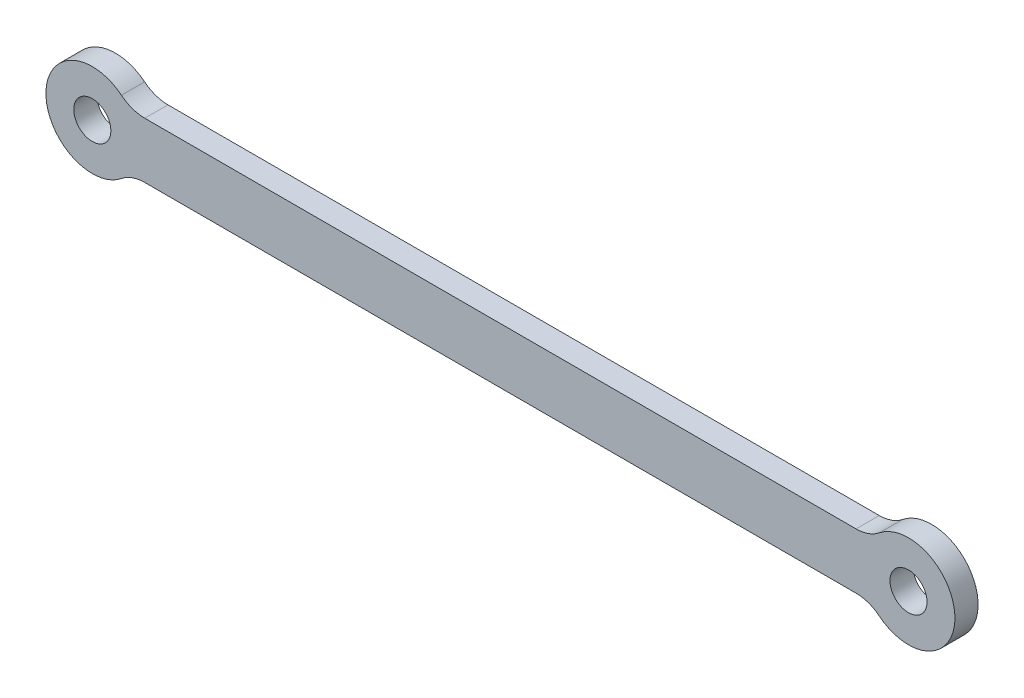
ISO-10303-21;
HEADER;
FILE_DESCRIPTION(('STEP AP214'),'2;1');
FILE_NAME('part.step','',(''),(''),'','','');
FILE_SCHEMA(('AUTOMOTIVE_DESIGN { 1 0 10303 214 1 1 1 1 }'));
ENDSEC;
DATA;
#1=APPLICATION_CONTEXT('core data for automotive mechanical design processes');
#2=APPLICATION_PROTOCOL_DEFINITION('international standard','automotive_design',2000,#1);
#3=PRODUCT_CONTEXT('',#1,'mechanical');
#4=PRODUCT('Part','Part','',(#3));
#5=PRODUCT_RELATED_PRODUCT_CATEGORY('part','',(#4));
#6=PRODUCT_DEFINITION_FORMATION('','',#4);
#7=PRODUCT_DEFINITION_CONTEXT('part definition',#1,'design');
#8=PRODUCT_DEFINITION('design','',#6,#7);
#9=PRODUCT_DEFINITION_SHAPE('','',#8);
#10=(LENGTH_UNIT() NAMED_UNIT(*) SI_UNIT(.MILLI.,.METRE.));
#11=(NAMED_UNIT(*) PLANE_ANGLE_UNIT() SI_UNIT($,.RADIAN.));
#12=(NAMED_UNIT(*) SI_UNIT($,.STERADIAN.) SOLID_ANGLE_UNIT());
#13=UNCERTAINTY_MEASURE_WITH_UNIT(LENGTH_MEASURE(1.E-05),#10,'distance_accuracy_value','');
#14=(GEOMETRIC_REPRESENTATION_CONTEXT(3) GLOBAL_UNCERTAINTY_ASSIGNED_CONTEXT((#13)) GLOBAL_UNIT_ASSIGNED_CONTEXT((#10,
#11,#12)) REPRESENTATION_CONTEXT('',''));
#15=CARTESIAN_POINT('',(0.,0.,0.));
#16=DIRECTION('',(0.,0.,1.));
#17=DIRECTION('',(1.,0.,0.));
#18=AXIS2_PLACEMENT_3D('',#15,#16,#17);
#19=CARTESIAN_POINT('',(-88.,0.,5.));
#20=DIRECTION('',(0.,0.,1.));
#21=DIRECTION('',(1.,0.,0.));
#22=AXIS2_PLACEMENT_3D('',#19,#20,#21);
#23=PLANE('',#22);
#24=CARTESIAN_POINT('',(-88.,0.,5.));
#25=DIRECTION('',(0.,0.,1.));
#26=DIRECTION('',(1.,0.,0.));
#27=AXIS2_PLACEMENT_3D('',#24,#25,#26);
#28=CIRCLE('',#27,4.00000000000001);
#29=CARTESIAN_POINT('',(-84.,0.,5.));
#30=VERTEX_POINT('',#29);
#31=EDGE_CURVE('E186',#30,#30,#28,.T.);
#32=ORIENTED_EDGE('',*,*,#31,.F.);
#33=EDGE_LOOP('',(#32));
#34=FACE_BOUND('',#33,.T.);
#35=CARTESIAN_POINT('',(88.,0.,5.));
#36=DIRECTION('',(0.,0.,1.));
#37=DIRECTION('',(1.,0.,0.));
#38=AXIS2_PLACEMENT_3D('',#35,#36,#37);
#39=CIRCLE('',#38,4.00000000000001);
#40=CARTESIAN_POINT('',(92.,0.,5.));
#41=VERTEX_POINT('',#40);
#42=EDGE_CURVE('E183',#41,#41,#39,.T.);
#43=ORIENTED_EDGE('',*,*,#42,.F.);
#44=EDGE_LOOP('',(#43));
#45=FACE_BOUND('',#44,.T.);
#46=CARTESIAN_POINT('',(-88.,0.,5.));
#47=DIRECTION('',(0.,0.,1.));
#48=DIRECTION('',(1.,0.,0.));
#49=AXIS2_PLACEMENT_3D('',#46,#47,#48);
#50=CIRCLE('',#49,9.99999999999999);
#51=CARTESIAN_POINT('',(-81.7146063894529,7.7777777777778,5.));
#52=VERTEX_POINT('',#51);
#53=CARTESIAN_POINT('',(-81.7146063894529,-7.7777777777778,5.));
#54=VERTEX_POINT('',#53);
#55=EDGE_CURVE('E168',#52,#54,#50,.T.);
#56=ORIENTED_EDGE('',*,*,#55,.T.);
#57=CARTESIAN_POINT('',(-76.6862915010153,-14.,5.));
#58=DIRECTION('',(0.,0.,1.));
#59=DIRECTION('',(1.,0.,0.));
#60=AXIS2_PLACEMENT_3D('',#57,#58,#59);
#61=CIRCLE('',#60,8.);
#62=CARTESIAN_POINT('',(-76.6862915010153,-6.00000000000003,5.));
#63=VERTEX_POINT('',#62);
#64=EDGE_CURVE('E11',#54,#63,#61,.F.);
#65=ORIENTED_EDGE('',*,*,#64,.T.);
#66=DIRECTION('',(1.,0.,0.));
#67=VECTOR('',#66,1.);
#68=CARTESIAN_POINT('',(-88.,-6.00000000000003,5.));
#69=LINE('',#68,#67);
#70=CARTESIAN_POINT('',(76.6862915010153,-6.,5.));
#71=VERTEX_POINT('',#70);
#72=EDGE_CURVE('E123',#63,#71,#69,.T.);
#73=ORIENTED_EDGE('',*,*,#72,.T.);
#74=CARTESIAN_POINT('',(76.6862915010153,-14.,5.));
#75=DIRECTION('',(0.,0.,1.));
#76=DIRECTION('',(1.,0.,0.));
#77=AXIS2_PLACEMENT_3D('',#74,#75,#76);
#78=CIRCLE('',#77,8.);
#79=CARTESIAN_POINT('',(81.7146063894529,-7.77777777777776,5.));
#80=VERTEX_POINT('',#79);
#81=EDGE_CURVE('E53',#71,#80,#78,.F.);
#82=ORIENTED_EDGE('',*,*,#81,.T.);
#83=CARTESIAN_POINT('',(88.,0.,5.));
#84=DIRECTION('',(0.,0.,1.));
#85=DIRECTION('',(1.,0.,0.));
#86=AXIS2_PLACEMENT_3D('',#83,#84,#85);
#87=CIRCLE('',#86,9.99999999999999);
#88=CARTESIAN_POINT('',(81.7146063894529,7.77777777777782,5.));
#89=VERTEX_POINT('',#88);
#90=EDGE_CURVE('E108',#80,#89,#87,.T.);
#91=ORIENTED_EDGE('',*,*,#90,.T.);
#92=CARTESIAN_POINT('',(76.6862915010153,14.0000000000001,5.));
#93=DIRECTION('',(0.,0.,1.));
#94=DIRECTION('',(1.,0.,0.));
#95=AXIS2_PLACEMENT_3D('',#92,#93,#94);
#96=CIRCLE('',#95,8.);
#97=CARTESIAN_POINT('',(76.6862915010153,6.00000000000006,5.));
#98=VERTEX_POINT('',#97);
#99=EDGE_CURVE('E104',#89,#98,#96,.F.);
#100=ORIENTED_EDGE('',*,*,#99,.T.);
#101=DIRECTION('',(-1.,0.,0.));
#102=VECTOR('',#101,1.);
#103=CARTESIAN_POINT('',(-88.,6.00000000000003,5.));
#104=LINE('',#103,#102);
#105=CARTESIAN_POINT('',(-76.6862915010153,6.00000000000003,5.));
#106=VERTEX_POINT('',#105);
#107=EDGE_CURVE('E106',#98,#106,#104,.T.);
#108=ORIENTED_EDGE('',*,*,#107,.T.);
#109=CARTESIAN_POINT('',(-76.6862915010153,14.,5.));
#110=DIRECTION('',(0.,0.,1.));
#111=DIRECTION('',(1.,0.,0.));
#112=AXIS2_PLACEMENT_3D('',#109,#110,#111);
#113=CIRCLE('',#112,8.);
#114=EDGE_CURVE('E145',#106,#52,#113,.F.);
#115=ORIENTED_EDGE('',*,*,#114,.T.);
#116=EDGE_LOOP('',(#56,#65,#73,#82,#91,#100,#108,#115));
#117=FACE_BOUND('',#116,.T.);
#118=ADVANCED_FACE('F38',(#34,#45,#117),#23,.T.);
#119=CARTESIAN_POINT('',(-88.,0.,0.));
#120=DIRECTION('',(0.,0.,1.));
#121=DIRECTION('',(1.,0.,0.));
#122=AXIS2_PLACEMENT_3D('',#119,#120,#121);
#123=PLANE('',#122);
#124=CARTESIAN_POINT('',(-88.,0.,0.));
#125=DIRECTION('',(0.,0.,1.));
#126=DIRECTION('',(1.,0.,0.));
#127=AXIS2_PLACEMENT_3D('',#124,#125,#126);
#128=CIRCLE('',#127,4.00000000000001);
#129=CARTESIAN_POINT('',(-84.,0.,0.));
#130=VERTEX_POINT('',#129);
#131=EDGE_CURVE('E178',#130,#130,#128,.T.);
#132=ORIENTED_EDGE('',*,*,#131,.T.);
#133=EDGE_LOOP('',(#132));
#134=FACE_BOUND('',#133,.T.);
#135=CARTESIAN_POINT('',(88.,0.,0.));
#136=DIRECTION('',(0.,0.,1.));
#137=DIRECTION('',(1.,0.,0.));
#138=AXIS2_PLACEMENT_3D('',#135,#136,#137);
#139=CIRCLE('',#138,4.00000000000001);
#140=CARTESIAN_POINT('',(92.,0.,0.));
#141=VERTEX_POINT('',#140);
#142=EDGE_CURVE('E180',#141,#141,#139,.T.);
#143=ORIENTED_EDGE('',*,*,#142,.T.);
#144=EDGE_LOOP('',(#143));
#145=FACE_BOUND('',#144,.T.);
#146=DIRECTION('',(-1.,0.,0.));
#147=VECTOR('',#146,1.);
#148=CARTESIAN_POINT('',(-88.,6.00000000000003,0.));
#149=LINE('',#148,#147);
#150=CARTESIAN_POINT('',(76.6862915010153,6.00000000000006,0.));
#151=VERTEX_POINT('',#150);
#152=CARTESIAN_POINT('',(-76.6862915010153,6.00000000000003,0.));
#153=VERTEX_POINT('',#152);
#154=EDGE_CURVE('E130',#151,#153,#149,.T.);
#155=ORIENTED_EDGE('',*,*,#154,.F.);
#156=CARTESIAN_POINT('',(76.6862915010153,14.0000000000001,0.));
#157=DIRECTION('',(0.,0.,1.));
#158=DIRECTION('',(1.,0.,0.));
#159=AXIS2_PLACEMENT_3D('',#156,#157,#158);
#160=CIRCLE('',#159,8.);
#161=CARTESIAN_POINT('',(81.7146063894529,7.77777777777782,0.));
#162=VERTEX_POINT('',#161);
#163=EDGE_CURVE('E112',#151,#162,#160,.T.);
#164=ORIENTED_EDGE('',*,*,#163,.T.);
#165=CARTESIAN_POINT('',(88.,0.,0.));
#166=DIRECTION('',(0.,0.,1.));
#167=DIRECTION('',(1.,0.,0.));
#168=AXIS2_PLACEMENT_3D('',#165,#166,#167);
#169=CIRCLE('',#168,9.99999999999999);
#170=CARTESIAN_POINT('',(81.7146063894529,-7.77777777777776,0.));
#171=VERTEX_POINT('',#170);
#172=EDGE_CURVE('E175',#171,#162,#169,.T.);
#173=ORIENTED_EDGE('',*,*,#172,.F.);
#174=CARTESIAN_POINT('',(76.6862915010153,-14.,0.));
#175=DIRECTION('',(0.,0.,1.));
#176=DIRECTION('',(1.,0.,0.));
#177=AXIS2_PLACEMENT_3D('',#174,#175,#176);
#178=CIRCLE('',#177,8.);
#179=CARTESIAN_POINT('',(76.6862915010153,-6.,0.));
#180=VERTEX_POINT('',#179);
#181=EDGE_CURVE('E151',#171,#180,#178,.T.);
#182=ORIENTED_EDGE('',*,*,#181,.T.);
#183=DIRECTION('',(1.,0.,0.));
#184=VECTOR('',#183,1.);
#185=CARTESIAN_POINT('',(-88.,-6.00000000000003,0.));
#186=LINE('',#185,#184);
#187=CARTESIAN_POINT('',(-76.6862915010153,-6.00000000000003,0.));
#188=VERTEX_POINT('',#187);
#189=EDGE_CURVE('E160',#188,#180,#186,.T.);
#190=ORIENTED_EDGE('',*,*,#189,.F.);
#191=CARTESIAN_POINT('',(-76.6862915010153,-14.,0.));
#192=DIRECTION('',(0.,0.,1.));
#193=DIRECTION('',(1.,0.,0.));
#194=AXIS2_PLACEMENT_3D('',#191,#192,#193);
#195=CIRCLE('',#194,8.);
#196=CARTESIAN_POINT('',(-81.7146063894529,-7.7777777777778,0.));
#197=VERTEX_POINT('',#196);
#198=EDGE_CURVE('E46',#188,#197,#195,.T.);
#199=ORIENTED_EDGE('',*,*,#198,.T.);
#200=CARTESIAN_POINT('',(-88.,0.,0.));
#201=DIRECTION('',(0.,0.,1.));
#202=DIRECTION('',(1.,0.,0.));
#203=AXIS2_PLACEMENT_3D('',#200,#201,#202);
#204=CIRCLE('',#203,9.99999999999999);
#205=CARTESIAN_POINT('',(-81.7146063894529,7.7777777777778,0.));
#206=VERTEX_POINT('',#205);
#207=EDGE_CURVE('E157',#206,#197,#204,.T.);
#208=ORIENTED_EDGE('',*,*,#207,.F.);
#209=CARTESIAN_POINT('',(-76.6862915010153,14.,0.));
#210=DIRECTION('',(0.,0.,1.));
#211=DIRECTION('',(1.,0.,0.));
#212=AXIS2_PLACEMENT_3D('',#209,#210,#211);
#213=CIRCLE('',#212,8.);
#214=EDGE_CURVE('E147',#206,#153,#213,.T.);
#215=ORIENTED_EDGE('',*,*,#214,.T.);
#216=EDGE_LOOP('',(#155,#164,#173,#182,#190,#199,#208,#215));
#217=FACE_BOUND('',#216,.T.);
#218=ADVANCED_FACE('F156',(#134,#145,#217),#123,.F.);
#219=CARTESIAN_POINT('',(-88.,-6.00000000000003,5.));
#220=DIRECTION('',(0.,1.,0.));
#221=DIRECTION('',(-1.,0.,0.));
#222=AXIS2_PLACEMENT_3D('',#219,#220,#221);
#223=PLANE('',#222);
#224=ORIENTED_EDGE('',*,*,#189,.T.);
#225=DIRECTION('',(0.,0.,1.));
#226=VECTOR('',#225,1.);
#227=CARTESIAN_POINT('',(76.6862915010153,-6.,5.));
#228=LINE('',#227,#226);
#229=EDGE_CURVE('E143',#180,#71,#228,.T.);
#230=ORIENTED_EDGE('',*,*,#229,.T.);
#231=ORIENTED_EDGE('',*,*,#72,.F.);
#232=DIRECTION('',(0.,0.,1.));
#233=VECTOR('',#232,1.);
#234=CARTESIAN_POINT('',(-76.6862915010153,-6.00000000000003,5.));
#235=LINE('',#234,#233);
#236=EDGE_CURVE('E140',#63,#188,#235,.F.);
#237=ORIENTED_EDGE('',*,*,#236,.T.);
#238=EDGE_LOOP('',(#224,#230,#231,#237));
#239=FACE_BOUND('',#238,.T.);
#240=ADVANCED_FACE('F171',(#239),#223,.F.);
#241=CARTESIAN_POINT('',(-88.,6.00000000000003,5.));
#242=DIRECTION('',(0.,-1.,0.));
#243=DIRECTION('',(1.,0.,0.));
#244=AXIS2_PLACEMENT_3D('',#241,#242,#243);
#245=PLANE('',#244);
#246=ORIENTED_EDGE('',*,*,#154,.T.);
#247=DIRECTION('',(0.,0.,1.));
#248=VECTOR('',#247,1.);
#249=CARTESIAN_POINT('',(-76.6862915010153,6.00000000000003,5.));
#250=LINE('',#249,#248);
#251=EDGE_CURVE('E122',#153,#106,#250,.T.);
#252=ORIENTED_EDGE('',*,*,#251,.T.);
#253=ORIENTED_EDGE('',*,*,#107,.F.);
#254=DIRECTION('',(0.,0.,1.));
#255=VECTOR('',#254,1.);
#256=CARTESIAN_POINT('',(76.6862915010153,6.00000000000006,5.));
#257=LINE('',#256,#255);
#258=EDGE_CURVE('E119',#98,#151,#257,.F.);
#259=ORIENTED_EDGE('',*,*,#258,.T.);
#260=EDGE_LOOP('',(#246,#252,#253,#259));
#261=FACE_BOUND('',#260,.T.);
#262=ADVANCED_FACE('F118',(#261),#245,.F.);
#263=CARTESIAN_POINT('',(-88.,0.,0.));
#264=DIRECTION('',(0.,0.,1.));
#265=DIRECTION('',(1.,0.,0.));
#266=AXIS2_PLACEMENT_3D('',#263,#264,#265);
#267=CYLINDRICAL_SURFACE('',#266,9.99999999999999);
#268=ORIENTED_EDGE('',*,*,#55,.F.);
#269=DIRECTION('',(0.,0.,1.));
#270=VECTOR('',#269,1.);
#271=CARTESIAN_POINT('',(-81.7146063894529,7.77777777777779,0.));
#272=LINE('',#271,#270);
#273=EDGE_CURVE('E134',#52,#206,#272,.F.);
#274=ORIENTED_EDGE('',*,*,#273,.T.);
#275=ORIENTED_EDGE('',*,*,#207,.T.);
#276=DIRECTION('',(0.,0.,1.));
#277=VECTOR('',#276,1.);
#278=CARTESIAN_POINT('',(-81.7146063894529,-7.7777777777778,0.));
#279=LINE('',#278,#277);
#280=EDGE_CURVE('E127',#197,#54,#279,.T.);
#281=ORIENTED_EDGE('',*,*,#280,.T.);
#282=EDGE_LOOP('',(#268,#274,#275,#281));
#283=FACE_BOUND('',#282,.T.);
#284=ADVANCED_FACE('F166',(#283),#267,.T.);
#285=CARTESIAN_POINT('',(88.,0.,0.));
#286=DIRECTION('',(0.,0.,1.));
#287=DIRECTION('',(1.,0.,0.));
#288=AXIS2_PLACEMENT_3D('',#285,#286,#287);
#289=CYLINDRICAL_SURFACE('',#288,9.99999999999999);
#290=ORIENTED_EDGE('',*,*,#172,.T.);
#291=DIRECTION('',(0.,0.,1.));
#292=VECTOR('',#291,1.);
#293=CARTESIAN_POINT('',(81.7146063894529,7.77777777777782,0.));
#294=LINE('',#293,#292);
#295=EDGE_CURVE('E138',#162,#89,#294,.T.);
#296=ORIENTED_EDGE('',*,*,#295,.T.);
#297=ORIENTED_EDGE('',*,*,#90,.F.);
#298=DIRECTION('',(0.,0.,1.));
#299=VECTOR('',#298,1.);
#300=CARTESIAN_POINT('',(81.7146063894529,-7.77777777777777,0.));
#301=LINE('',#300,#299);
#302=EDGE_CURVE('E136',#80,#171,#301,.F.);
#303=ORIENTED_EDGE('',*,*,#302,.T.);
#304=EDGE_LOOP('',(#290,#296,#297,#303));
#305=FACE_BOUND('',#304,.T.);
#306=ADVANCED_FACE('F208',(#305),#289,.T.);
#307=CARTESIAN_POINT('',(88.,0.,0.));
#308=DIRECTION('',(0.,0.,1.));
#309=DIRECTION('',(1.,0.,0.));
#310=AXIS2_PLACEMENT_3D('',#307,#308,#309);
#311=CYLINDRICAL_SURFACE('',#310,4.00000000000001);
#312=ORIENTED_EDGE('',*,*,#142,.F.);
#313=EDGE_LOOP('',(#312));
#314=FACE_BOUND('',#313,.T.);
#315=ORIENTED_EDGE('',*,*,#42,.T.);
#316=EDGE_LOOP('',(#315));
#317=FACE_BOUND('',#316,.T.);
#318=ADVANCED_FACE('F198',(#314,#317),#311,.F.);
#319=CARTESIAN_POINT('',(-88.,0.,0.));
#320=DIRECTION('',(0.,0.,1.));
#321=DIRECTION('',(1.,0.,0.));
#322=AXIS2_PLACEMENT_3D('',#319,#320,#321);
#323=CYLINDRICAL_SURFACE('',#322,4.00000000000001);
#324=ORIENTED_EDGE('',*,*,#131,.F.);
#325=EDGE_LOOP('',(#324));
#326=FACE_BOUND('',#325,.T.);
#327=ORIENTED_EDGE('',*,*,#31,.T.);
#328=EDGE_LOOP('',(#327));
#329=FACE_BOUND('',#328,.T.);
#330=ADVANCED_FACE('F194',(#326,#329),#323,.F.);
#331=CARTESIAN_POINT('',(-76.6862915010153,14.,0.));
#332=DIRECTION('',(0.,0.,1.));
#333=DIRECTION('',(1.,0.,0.));
#334=AXIS2_PLACEMENT_3D('',#331,#332,#333);
#335=CYLINDRICAL_SURFACE('',#334,8.);
#336=ORIENTED_EDGE('',*,*,#214,.F.);
#337=ORIENTED_EDGE('',*,*,#273,.F.);
#338=ORIENTED_EDGE('',*,*,#114,.F.);
#339=ORIENTED_EDGE('',*,*,#251,.F.);
#340=EDGE_LOOP('',(#336,#337,#338,#339));
#341=FACE_BOUND('',#340,.T.);
#342=ADVANCED_FACE('F197',(#341),#335,.F.);
#343=CARTESIAN_POINT('',(76.6862915010153,14.0000000000001,0.));
#344=DIRECTION('',(0.,0.,1.));
#345=DIRECTION('',(1.,0.,0.));
#346=AXIS2_PLACEMENT_3D('',#343,#344,#345);
#347=CYLINDRICAL_SURFACE('',#346,8.);
#348=ORIENTED_EDGE('',*,*,#99,.F.);
#349=ORIENTED_EDGE('',*,*,#295,.F.);
#350=ORIENTED_EDGE('',*,*,#163,.F.);
#351=ORIENTED_EDGE('',*,*,#258,.F.);
#352=EDGE_LOOP('',(#348,#349,#350,#351));
#353=FACE_BOUND('',#352,.T.);
#354=ADVANCED_FACE('F125',(#353),#347,.F.);
#355=CARTESIAN_POINT('',(76.6862915010153,-14.,0.));
#356=DIRECTION('',(0.,0.,1.));
#357=DIRECTION('',(1.,0.,0.));
#358=AXIS2_PLACEMENT_3D('',#355,#356,#357);
#359=CYLINDRICAL_SURFACE('',#358,8.);
#360=ORIENTED_EDGE('',*,*,#181,.F.);
#361=ORIENTED_EDGE('',*,*,#302,.F.);
#362=ORIENTED_EDGE('',*,*,#81,.F.);
#363=ORIENTED_EDGE('',*,*,#229,.F.);
#364=EDGE_LOOP('',(#360,#361,#362,#363));
#365=FACE_BOUND('',#364,.T.);
#366=ADVANCED_FACE('F230',(#365),#359,.F.);
#367=CARTESIAN_POINT('',(-76.6862915010153,-14.,0.));
#368=DIRECTION('',(0.,0.,1.));
#369=DIRECTION('',(1.,0.,0.));
#370=AXIS2_PLACEMENT_3D('',#367,#368,#369);
#371=CYLINDRICAL_SURFACE('',#370,8.);
#372=ORIENTED_EDGE('',*,*,#64,.F.);
#373=ORIENTED_EDGE('',*,*,#280,.F.);
#374=ORIENTED_EDGE('',*,*,#198,.F.);
#375=ORIENTED_EDGE('',*,*,#236,.F.);
#376=EDGE_LOOP('',(#372,#373,#374,#375));
#377=FACE_BOUND('',#376,.T.);
#378=ADVANCED_FACE('F40',(#377),#371,.F.);
#379=CLOSED_SHELL('',(#118,#218,#240,#262,#284,#306,#318,#330,#342,#354,#366,#378));
#380=MANIFOLD_SOLID_BREP('B2',#379);
#381=ADVANCED_BREP_SHAPE_REPRESENTATION('',(#18,#380),#14);
#382=SHAPE_DEFINITION_REPRESENTATION(#9,#381);
ENDSEC;
END-ISO-10303-21;
